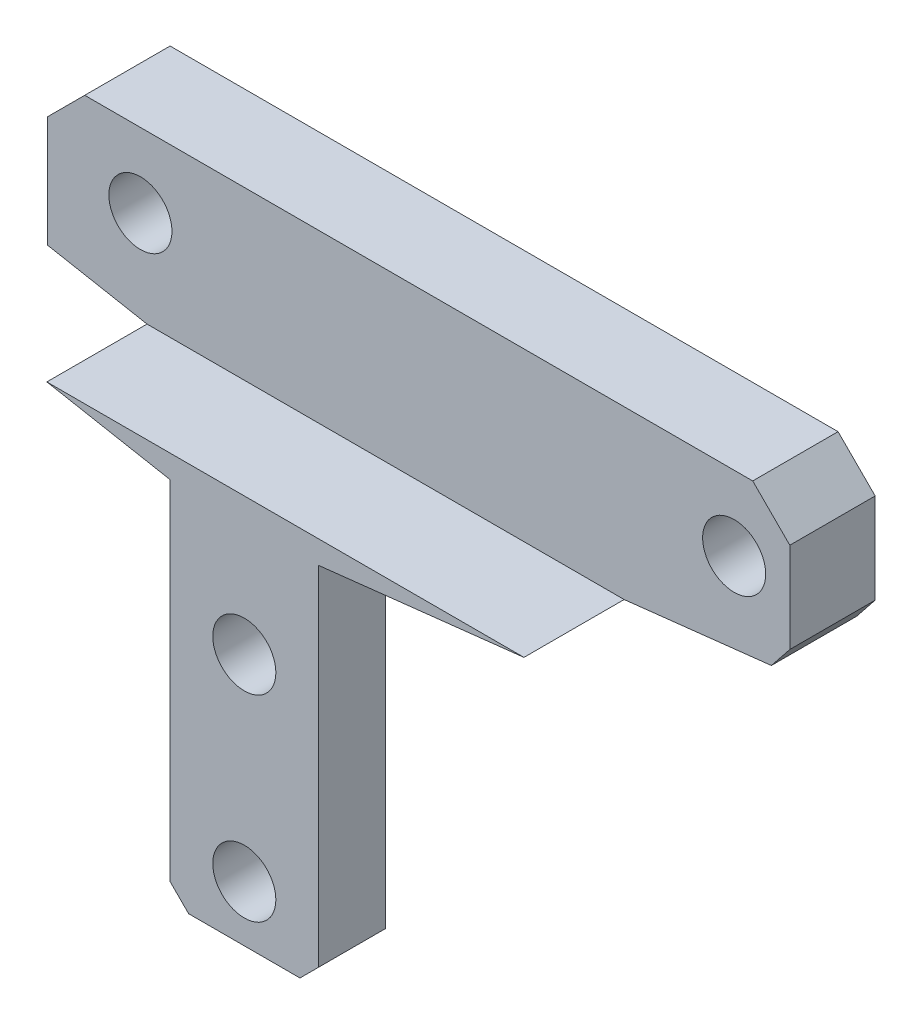
ISO-10303-21;
HEADER;
FILE_DESCRIPTION(('STEP AP214'),'2;1');
FILE_NAME('part.step','',(''),(''),'','','');
FILE_SCHEMA(('AUTOMOTIVE_DESIGN { 1 0 10303 214 1 1 1 1 }'));
ENDSEC;
DATA;
#1=APPLICATION_CONTEXT('core data for automotive mechanical design processes');
#2=APPLICATION_PROTOCOL_DEFINITION('international standard','automotive_design',2000,#1);
#3=PRODUCT_CONTEXT('',#1,'mechanical');
#4=PRODUCT('Part','Part','',(#3));
#5=PRODUCT_RELATED_PRODUCT_CATEGORY('part','',(#4));
#6=PRODUCT_DEFINITION_FORMATION('','',#4);
#7=PRODUCT_DEFINITION_CONTEXT('part definition',#1,'design');
#8=PRODUCT_DEFINITION('design','',#6,#7);
#9=PRODUCT_DEFINITION_SHAPE('','',#8);
#10=(LENGTH_UNIT() NAMED_UNIT(*) SI_UNIT(.MILLI.,.METRE.));
#11=(NAMED_UNIT(*) PLANE_ANGLE_UNIT() SI_UNIT($,.RADIAN.));
#12=(NAMED_UNIT(*) SI_UNIT($,.STERADIAN.) SOLID_ANGLE_UNIT());
#13=UNCERTAINTY_MEASURE_WITH_UNIT(LENGTH_MEASURE(1.E-05),#10,'distance_accuracy_value','');
#14=(GEOMETRIC_REPRESENTATION_CONTEXT(3) GLOBAL_UNCERTAINTY_ASSIGNED_CONTEXT((#13)) GLOBAL_UNIT_ASSIGNED_CONTEXT((#10,
#11,#12)) REPRESENTATION_CONTEXT('',''));
#15=CARTESIAN_POINT('',(0.,0.,0.));
#16=DIRECTION('',(0.,0.,1.));
#17=DIRECTION('',(1.,0.,0.));
#18=AXIS2_PLACEMENT_3D('',#15,#16,#17);
#19=CARTESIAN_POINT('',(10.,2.,5.5));
#20=DIRECTION('',(-1.,0.,0.));
#21=DIRECTION('',(0.,-1.,0.));
#22=AXIS2_PLACEMENT_3D('',#19,#20,#21);
#23=PLANE('',#22);
#24=DIRECTION('',(0.,0.,-1.));
#25=VECTOR('',#24,1.);
#26=CARTESIAN_POINT('',(10.,-1.43341641136647,5.5));
#27=LINE('',#26,#25);
#28=CARTESIAN_POINT('',(10.,-1.43341641136647,3.3));
#29=VERTEX_POINT('',#28);
#30=CARTESIAN_POINT('',(10.,-1.43341641136647,1.));
#31=VERTEX_POINT('',#30);
#32=EDGE_CURVE('E317',#29,#31,#27,.T.);
#33=ORIENTED_EDGE('',*,*,#32,.T.);
#34=DIRECTION('',(0.,-1.,0.));
#35=VECTOR('',#34,1.);
#36=CARTESIAN_POINT('',(10.,0.999999999999999,1.));
#37=LINE('',#36,#35);
#38=CARTESIAN_POINT('',(10.,0.999999999999999,1.));
#39=VERTEX_POINT('',#38);
#40=EDGE_CURVE('E57',#39,#31,#37,.T.);
#41=ORIENTED_EDGE('',*,*,#40,.F.);
#42=DIRECTION('',(0.,0.,1.));
#43=VECTOR('',#42,1.);
#44=CARTESIAN_POINT('',(10.,0.999999999999999,5.5));
#45=LINE('',#44,#43);
#46=CARTESIAN_POINT('',(10.,0.999999999999999,3.3));
#47=VERTEX_POINT('',#46);
#48=EDGE_CURVE('E299',#39,#47,#45,.T.);
#49=ORIENTED_EDGE('',*,*,#48,.T.);
#50=DIRECTION('',(0.,1.,0.));
#51=VECTOR('',#50,1.);
#52=CARTESIAN_POINT('',(10.,-2.5,3.3));
#53=LINE('',#52,#51);
#54=EDGE_CURVE('E251',#29,#47,#53,.T.);
#55=ORIENTED_EDGE('',*,*,#54,.F.);
#56=EDGE_LOOP('',(#33,#41,#49,#55));
#57=FACE_BOUND('',#56,.T.);
#58=ADVANCED_FACE('F41',(#57),#23,.F.);
#59=CARTESIAN_POINT('',(-10.,2.,5.5));
#60=DIRECTION('',(0.,-1.,0.));
#61=DIRECTION('',(0.,0.,-1.));
#62=AXIS2_PLACEMENT_3D('',#59,#60,#61);
#63=PLANE('',#62);
#64=DIRECTION('',(0.,0.,-1.));
#65=VECTOR('',#64,1.);
#66=CARTESIAN_POINT('',(9.00000000000001,2.,5.5));
#67=LINE('',#66,#65);
#68=CARTESIAN_POINT('',(9.00000000000001,2.,3.3));
#69=VERTEX_POINT('',#68);
#70=CARTESIAN_POINT('',(9.00000000000001,2.,1.));
#71=VERTEX_POINT('',#70);
#72=EDGE_CURVE('E294',#69,#71,#67,.T.);
#73=ORIENTED_EDGE('',*,*,#72,.T.);
#74=DIRECTION('',(1.,0.,0.));
#75=VECTOR('',#74,1.);
#76=CARTESIAN_POINT('',(-8.99999999999999,2.,1.));
#77=LINE('',#76,#75);
#78=CARTESIAN_POINT('',(-8.99999999999999,2.,1.));
#79=VERTEX_POINT('',#78);
#80=EDGE_CURVE('E231',#79,#71,#77,.T.);
#81=ORIENTED_EDGE('',*,*,#80,.F.);
#82=DIRECTION('',(0.,0.,1.));
#83=VECTOR('',#82,1.);
#84=CARTESIAN_POINT('',(-8.99999999999999,2.,5.5));
#85=LINE('',#84,#83);
#86=CARTESIAN_POINT('',(-8.99999999999999,2.,3.3));
#87=VERTEX_POINT('',#86);
#88=EDGE_CURVE('E297',#79,#87,#85,.T.);
#89=ORIENTED_EDGE('',*,*,#88,.T.);
#90=DIRECTION('',(-1.,0.,0.));
#91=VECTOR('',#90,1.);
#92=CARTESIAN_POINT('',(9.00000000000001,2.,3.3));
#93=LINE('',#92,#91);
#94=EDGE_CURVE('E241',#69,#87,#93,.T.);
#95=ORIENTED_EDGE('',*,*,#94,.F.);
#96=EDGE_LOOP('',(#73,#81,#89,#95));
#97=FACE_BOUND('',#96,.T.);
#98=ADVANCED_FACE('F349',(#97),#63,.F.);
#99=CARTESIAN_POINT('',(-10.,2.,5.5));
#100=DIRECTION('',(1.,0.,0.));
#101=DIRECTION('',(0.,1.,0.));
#102=AXIS2_PLACEMENT_3D('',#99,#100,#101);
#103=PLANE('',#102);
#104=DIRECTION('',(0.,0.,-1.));
#105=VECTOR('',#104,1.);
#106=CARTESIAN_POINT('',(-10.,0.999999999999998,5.5));
#107=LINE('',#106,#105);
#108=CARTESIAN_POINT('',(-10.,0.999999999999998,3.3));
#109=VERTEX_POINT('',#108);
#110=CARTESIAN_POINT('',(-10.,0.999999999999998,1.));
#111=VERTEX_POINT('',#110);
#112=EDGE_CURVE('E291',#109,#111,#107,.T.);
#113=ORIENTED_EDGE('',*,*,#112,.T.);
#114=DIRECTION('',(0.,1.,0.));
#115=VECTOR('',#114,1.);
#116=CARTESIAN_POINT('',(-9.99999999999999,-2.,1.));
#117=LINE('',#116,#115);
#118=CARTESIAN_POINT('',(-9.99999999999999,-2.,1.));
#119=VERTEX_POINT('',#118);
#120=EDGE_CURVE('E227',#119,#111,#117,.T.);
#121=ORIENTED_EDGE('',*,*,#120,.F.);
#122=DIRECTION('',(0.,0.,-1.));
#123=VECTOR('',#122,1.);
#124=CARTESIAN_POINT('',(-9.99999999999999,-2.,5.5));
#125=LINE('',#124,#123);
#126=CARTESIAN_POINT('',(-9.99999999999999,-2.,3.3));
#127=VERTEX_POINT('',#126);
#128=EDGE_CURVE('E278',#127,#119,#125,.T.);
#129=ORIENTED_EDGE('',*,*,#128,.F.);
#130=DIRECTION('',(0.,-1.,0.));
#131=VECTOR('',#130,1.);
#132=CARTESIAN_POINT('',(-10.,0.999999999999998,3.3));
#133=LINE('',#132,#131);
#134=EDGE_CURVE('E246',#109,#127,#133,.T.);
#135=ORIENTED_EDGE('',*,*,#134,.F.);
#136=EDGE_LOOP('',(#113,#121,#129,#135));
#137=FACE_BOUND('',#136,.T.);
#138=ADVANCED_FACE('F339',(#137),#103,.F.);
#139=CARTESIAN_POINT('',(-7.5,0.,5.5));
#140=DIRECTION('',(0.,0.,-1.));
#141=DIRECTION('',(-1.,0.,0.));
#142=AXIS2_PLACEMENT_3D('',#139,#140,#141);
#143=CYLINDRICAL_SURFACE('',#142,0.85);
#144=CARTESIAN_POINT('',(-7.5,0.,1.));
#145=DIRECTION('',(0.,0.,-1.));
#146=DIRECTION('',(-1.,0.,0.));
#147=AXIS2_PLACEMENT_3D('',#144,#145,#146);
#148=CIRCLE('',#147,0.85);
#149=CARTESIAN_POINT('',(-8.35,0.,1.));
#150=VERTEX_POINT('',#149);
#151=EDGE_CURVE('E213',#150,#150,#148,.T.);
#152=ORIENTED_EDGE('',*,*,#151,.T.);
#153=EDGE_LOOP('',(#152));
#154=FACE_BOUND('',#153,.T.);
#155=CARTESIAN_POINT('',(-7.5,0.,3.3));
#156=DIRECTION('',(0.,0.,1.));
#157=DIRECTION('',(1.,0.,0.));
#158=AXIS2_PLACEMENT_3D('',#155,#156,#157);
#159=CIRCLE('',#158,0.85);
#160=CARTESIAN_POINT('',(-6.65,0.,3.3));
#161=VERTEX_POINT('',#160);
#162=EDGE_CURVE('E233',#161,#161,#159,.T.);
#163=ORIENTED_EDGE('',*,*,#162,.T.);
#164=EDGE_LOOP('',(#163));
#165=FACE_BOUND('',#164,.T.);
#166=ADVANCED_FACE('F437',(#154,#165),#143,.F.);
#167=CARTESIAN_POINT('',(8.5,0.,5.5));
#168=DIRECTION('',(0.,0.,-1.));
#169=DIRECTION('',(-1.,0.,0.));
#170=AXIS2_PLACEMENT_3D('',#167,#168,#169);
#171=CYLINDRICAL_SURFACE('',#170,0.85);
#172=CARTESIAN_POINT('',(8.5,0.,1.));
#173=DIRECTION('',(0.,0.,-1.));
#174=DIRECTION('',(-1.,0.,0.));
#175=AXIS2_PLACEMENT_3D('',#172,#173,#174);
#176=CIRCLE('',#175,0.85);
#177=CARTESIAN_POINT('',(7.65,0.,1.));
#178=VERTEX_POINT('',#177);
#179=EDGE_CURVE('E210',#178,#178,#176,.T.);
#180=ORIENTED_EDGE('',*,*,#179,.T.);
#181=EDGE_LOOP('',(#180));
#182=FACE_BOUND('',#181,.T.);
#183=CARTESIAN_POINT('',(8.5,0.,3.3));
#184=DIRECTION('',(0.,0.,1.));
#185=DIRECTION('',(1.,0.,0.));
#186=AXIS2_PLACEMENT_3D('',#183,#184,#185);
#187=CIRCLE('',#186,0.85);
#188=CARTESIAN_POINT('',(9.35,0.,3.3));
#189=VERTEX_POINT('',#188);
#190=EDGE_CURVE('E236',#189,#189,#187,.T.);
#191=ORIENTED_EDGE('',*,*,#190,.T.);
#192=EDGE_LOOP('',(#191));
#193=FACE_BOUND('',#192,.T.);
#194=ADVANCED_FACE('F367',(#182,#193),#171,.F.);
#195=CARTESIAN_POINT('',(-10.,0.999999999999999,5.5));
#196=DIRECTION('',(0.707106781186546,-0.707106781186549,0.));
#197=DIRECTION('',(0.,0.,-1.));
#198=AXIS2_PLACEMENT_3D('',#195,#196,#197);
#199=PLANE('',#198);
#200=DIRECTION('',(0.707106781186548,0.707106781186547,0.));
#201=VECTOR('',#200,1.);
#202=CARTESIAN_POINT('',(-10.,0.999999999999998,1.));
#203=LINE('',#202,#201);
#204=EDGE_CURVE('E229',#111,#79,#203,.T.);
#205=ORIENTED_EDGE('',*,*,#204,.F.);
#206=ORIENTED_EDGE('',*,*,#112,.F.);
#207=DIRECTION('',(-0.707106781186548,-0.707106781186547,0.));
#208=VECTOR('',#207,1.);
#209=CARTESIAN_POINT('',(-8.99999999999999,2.,3.3));
#210=LINE('',#209,#208);
#211=EDGE_CURVE('E244',#87,#109,#210,.T.);
#212=ORIENTED_EDGE('',*,*,#211,.F.);
#213=ORIENTED_EDGE('',*,*,#88,.F.);
#214=EDGE_LOOP('',(#205,#206,#212,#213));
#215=FACE_BOUND('',#214,.T.);
#216=ADVANCED_FACE('F345',(#215),#199,.F.);
#217=CARTESIAN_POINT('',(9.00000000000001,2.,5.5));
#218=DIRECTION('',(-0.707106781186549,-0.707106781186546,0.));
#219=DIRECTION('',(0.,0.,-1.));
#220=AXIS2_PLACEMENT_3D('',#217,#218,#219);
#221=PLANE('',#220);
#222=DIRECTION('',(0.707106781186546,-0.707106781186549,0.));
#223=VECTOR('',#222,1.);
#224=CARTESIAN_POINT('',(9.00000000000001,2.,1.));
#225=LINE('',#224,#223);
#226=EDGE_CURVE('E216',#71,#39,#225,.T.);
#227=ORIENTED_EDGE('',*,*,#226,.F.);
#228=ORIENTED_EDGE('',*,*,#72,.F.);
#229=DIRECTION('',(-0.707106781186546,0.707106781186549,0.));
#230=VECTOR('',#229,1.);
#231=CARTESIAN_POINT('',(10.,0.999999999999999,3.3));
#232=LINE('',#231,#230);
#233=EDGE_CURVE('E239',#47,#69,#232,.T.);
#234=ORIENTED_EDGE('',*,*,#233,.F.);
#235=ORIENTED_EDGE('',*,*,#48,.F.);
#236=EDGE_LOOP('',(#227,#228,#234,#235));
#237=FACE_BOUND('',#236,.T.);
#238=ADVANCED_FACE('F356',(#237),#221,.F.);
#239=CARTESIAN_POINT('',(-4.,-3.12,5.5));
#240=DIRECTION('',(1.,0.,0.));
#241=DIRECTION('',(0.,1.,0.));
#242=AXIS2_PLACEMENT_3D('',#239,#240,#241);
#243=PLANE('',#242);
#244=DIRECTION('',(0.,1.,0.));
#245=VECTOR('',#244,1.);
#246=CARTESIAN_POINT('',(-4.,-13.,4.2));
#247=LINE('',#246,#245);
#248=CARTESIAN_POINT('',(-4.,-12.5,4.2));
#249=VERTEX_POINT('',#248);
#250=CARTESIAN_POINT('',(-4.,-4.12000000000001,4.2));
#251=VERTEX_POINT('',#250);
#252=EDGE_CURVE('E268',#249,#251,#247,.T.);
#253=ORIENTED_EDGE('',*,*,#252,.F.);
#254=DIRECTION('',(0.,0.,1.));
#255=VECTOR('',#254,1.);
#256=CARTESIAN_POINT('',(-4.,-12.5,5.5));
#257=LINE('',#256,#255);
#258=CARTESIAN_POINT('',(-4.,-12.5,6.));
#259=VERTEX_POINT('',#258);
#260=EDGE_CURVE('E310',#249,#259,#257,.T.);
#261=ORIENTED_EDGE('',*,*,#260,.T.);
#262=DIRECTION('',(0.,-1.,0.));
#263=VECTOR('',#262,1.);
#264=CARTESIAN_POINT('',(-4.,-3.12,6.));
#265=LINE('',#264,#263);
#266=CARTESIAN_POINT('',(-4.,-3.12,6.));
#267=VERTEX_POINT('',#266);
#268=EDGE_CURVE('E201',#267,#259,#265,.T.);
#269=ORIENTED_EDGE('',*,*,#268,.F.);
#270=DIRECTION('',(0.,0.,-1.));
#271=VECTOR('',#270,1.);
#272=CARTESIAN_POINT('',(-4.,-3.12,5.5));
#273=LINE('',#272,#271);
#274=CARTESIAN_POINT('',(-4.,-3.12,3.2));
#275=VERTEX_POINT('',#274);
#276=EDGE_CURVE('E172',#267,#275,#273,.T.);
#277=ORIENTED_EDGE('',*,*,#276,.T.);
#278=DIRECTION('',(0.,-0.707106781186551,0.707106781186544));
#279=VECTOR('',#278,1.);
#280=CARTESIAN_POINT('',(-4.,-4.27,4.34999999999999));
#281=LINE('',#280,#279);
#282=EDGE_CURVE('E288',#275,#251,#281,.T.);
#283=ORIENTED_EDGE('',*,*,#282,.T.);
#284=EDGE_LOOP('',(#253,#261,#269,#277,#283));
#285=FACE_BOUND('',#284,.T.);
#286=ADVANCED_FACE('F358',(#285),#243,.F.);
#287=CARTESIAN_POINT('',(-4.,-13.,5.5));
#288=DIRECTION('',(0.,1.,0.));
#289=DIRECTION('',(0.,0.,1.));
#290=AXIS2_PLACEMENT_3D('',#287,#288,#289);
#291=PLANE('',#290);
#292=DIRECTION('',(0.,0.,1.));
#293=VECTOR('',#292,1.);
#294=CARTESIAN_POINT('',(-0.500000000000001,-13.,5.5));
#295=LINE('',#294,#293);
#296=CARTESIAN_POINT('',(-0.500000000000001,-13.,4.2));
#297=VERTEX_POINT('',#296);
#298=CARTESIAN_POINT('',(-0.500000000000001,-13.,6.));
#299=VERTEX_POINT('',#298);
#300=EDGE_CURVE('E301',#297,#299,#295,.T.);
#301=ORIENTED_EDGE('',*,*,#300,.T.);
#302=DIRECTION('',(1.,0.,0.));
#303=VECTOR('',#302,1.);
#304=CARTESIAN_POINT('',(-3.5,-13.,6.));
#305=LINE('',#304,#303);
#306=CARTESIAN_POINT('',(-3.5,-13.,6.));
#307=VERTEX_POINT('',#306);
#308=EDGE_CURVE('E207',#307,#299,#305,.T.);
#309=ORIENTED_EDGE('',*,*,#308,.F.);
#310=DIRECTION('',(0.,0.,-1.));
#311=VECTOR('',#310,1.);
#312=CARTESIAN_POINT('',(-3.5,-13.,5.5));
#313=LINE('',#312,#311);
#314=CARTESIAN_POINT('',(-3.5,-13.,4.2));
#315=VERTEX_POINT('',#314);
#316=EDGE_CURVE('E303',#307,#315,#313,.T.);
#317=ORIENTED_EDGE('',*,*,#316,.T.);
#318=DIRECTION('',(-1.,0.,0.));
#319=VECTOR('',#318,1.);
#320=CARTESIAN_POINT('',(0.,-13.,4.2));
#321=LINE('',#320,#319);
#322=EDGE_CURVE('E265',#297,#315,#321,.T.);
#323=ORIENTED_EDGE('',*,*,#322,.F.);
#324=EDGE_LOOP('',(#301,#309,#317,#323));
#325=FACE_BOUND('',#324,.T.);
#326=ADVANCED_FACE('F364',(#325),#291,.F.);
#327=CARTESIAN_POINT('',(0.,-3.12,5.5));
#328=DIRECTION('',(-1.,0.,0.));
#329=DIRECTION('',(0.,-1.,0.));
#330=AXIS2_PLACEMENT_3D('',#327,#328,#329);
#331=PLANE('',#330);
#332=DIRECTION('',(0.,0.,-1.));
#333=VECTOR('',#332,1.);
#334=CARTESIAN_POINT('',(0.,-3.12,5.5));
#335=LINE('',#334,#333);
#336=CARTESIAN_POINT('',(0.,-3.12,6.));
#337=VERTEX_POINT('',#336);
#338=CARTESIAN_POINT('',(0.,-3.12,3.2));
#339=VERTEX_POINT('',#338);
#340=EDGE_CURVE('E161',#337,#339,#335,.T.);
#341=ORIENTED_EDGE('',*,*,#340,.F.);
#342=DIRECTION('',(0.,1.,0.));
#343=VECTOR('',#342,1.);
#344=CARTESIAN_POINT('',(0.,-12.5,6.));
#345=LINE('',#344,#343);
#346=CARTESIAN_POINT('',(0.,-12.5,6.));
#347=VERTEX_POINT('',#346);
#348=EDGE_CURVE('E166',#347,#337,#345,.T.);
#349=ORIENTED_EDGE('',*,*,#348,.F.);
#350=DIRECTION('',(0.,0.,-1.));
#351=VECTOR('',#350,1.);
#352=CARTESIAN_POINT('',(0.,-12.5,5.5));
#353=LINE('',#352,#351);
#354=CARTESIAN_POINT('',(0.,-12.5,4.2));
#355=VERTEX_POINT('',#354);
#356=EDGE_CURVE('E312',#347,#355,#353,.T.);
#357=ORIENTED_EDGE('',*,*,#356,.T.);
#358=DIRECTION('',(0.,-1.,0.));
#359=VECTOR('',#358,1.);
#360=CARTESIAN_POINT('',(0.,-3.12,4.2));
#361=LINE('',#360,#359);
#362=CARTESIAN_POINT('',(0.,-4.12000000000001,4.2));
#363=VERTEX_POINT('',#362);
#364=EDGE_CURVE('E270',#363,#355,#361,.T.);
#365=ORIENTED_EDGE('',*,*,#364,.F.);
#366=DIRECTION('',(0.,0.707106781186551,-0.707106781186544));
#367=VECTOR('',#366,1.);
#368=CARTESIAN_POINT('',(0.,-4.27,4.34999999999999));
#369=LINE('',#368,#367);
#370=EDGE_CURVE('E168',#363,#339,#369,.T.);
#371=ORIENTED_EDGE('',*,*,#370,.T.);
#372=EDGE_LOOP('',(#341,#349,#357,#365,#371));
#373=FACE_BOUND('',#372,.T.);
#374=ADVANCED_FACE('F163',(#373),#331,.F.);
#375=CARTESIAN_POINT('',(-2.,-11.5,5.5));
#376=DIRECTION('',(0.,0.,-1.));
#377=DIRECTION('',(-1.,0.,0.));
#378=AXIS2_PLACEMENT_3D('',#375,#376,#377);
#379=CYLINDRICAL_SURFACE('',#378,0.85);
#380=CARTESIAN_POINT('',(-2.,-11.5,4.2));
#381=DIRECTION('',(0.,0.,-1.));
#382=DIRECTION('',(-1.,0.,0.));
#383=AXIS2_PLACEMENT_3D('',#380,#381,#382);
#384=CIRCLE('',#383,0.85);
#385=CARTESIAN_POINT('',(-2.85,-11.5,4.2));
#386=VERTEX_POINT('',#385);
#387=EDGE_CURVE('E262',#386,#386,#384,.T.);
#388=ORIENTED_EDGE('',*,*,#387,.T.);
#389=EDGE_LOOP('',(#388));
#390=FACE_BOUND('',#389,.T.);
#391=CARTESIAN_POINT('',(-2.,-11.5,6.));
#392=DIRECTION('',(0.,0.,1.));
#393=DIRECTION('',(1.,0.,0.));
#394=AXIS2_PLACEMENT_3D('',#391,#392,#393);
#395=CIRCLE('',#394,0.85);
#396=CARTESIAN_POINT('',(-1.15,-11.5,6.));
#397=VERTEX_POINT('',#396);
#398=EDGE_CURVE('E190',#397,#397,#395,.T.);
#399=ORIENTED_EDGE('',*,*,#398,.T.);
#400=EDGE_LOOP('',(#399));
#401=FACE_BOUND('',#400,.T.);
#402=ADVANCED_FACE('F431',(#390,#401),#379,.F.);
#403=CARTESIAN_POINT('',(-2.,-6.2,5.5));
#404=DIRECTION('',(0.,0.,-1.));
#405=DIRECTION('',(-1.,0.,0.));
#406=AXIS2_PLACEMENT_3D('',#403,#404,#405);
#407=CYLINDRICAL_SURFACE('',#406,0.85);
#408=CARTESIAN_POINT('',(-2.,-6.2,4.2));
#409=DIRECTION('',(0.,0.,-1.));
#410=DIRECTION('',(-1.,0.,0.));
#411=AXIS2_PLACEMENT_3D('',#408,#409,#410);
#412=CIRCLE('',#411,0.85);
#413=CARTESIAN_POINT('',(-2.85,-6.2,4.2));
#414=VERTEX_POINT('',#413);
#415=EDGE_CURVE('E259',#414,#414,#412,.T.);
#416=ORIENTED_EDGE('',*,*,#415,.T.);
#417=EDGE_LOOP('',(#416));
#418=FACE_BOUND('',#417,.T.);
#419=CARTESIAN_POINT('',(-2.,-6.2,6.));
#420=DIRECTION('',(0.,0.,1.));
#421=DIRECTION('',(1.,0.,0.));
#422=AXIS2_PLACEMENT_3D('',#419,#420,#421);
#423=CIRCLE('',#422,0.85);
#424=CARTESIAN_POINT('',(-1.15,-6.2,6.));
#425=VERTEX_POINT('',#424);
#426=EDGE_CURVE('E193',#425,#425,#423,.T.);
#427=ORIENTED_EDGE('',*,*,#426,.T.);
#428=EDGE_LOOP('',(#427));
#429=FACE_BOUND('',#428,.T.);
#430=ADVANCED_FACE('F381',(#418,#429),#407,.F.);
#431=CARTESIAN_POINT('',(0.,-3.12,5.5));
#432=DIRECTION('',(-0.111304076447319,0.993786396851059,0.));
#433=DIRECTION('',(-0.993786396851058,-0.111304076447319,0.));
#434=AXIS2_PLACEMENT_3D('',#431,#432,#433);
#435=PLANE('',#434);
#436=DIRECTION('',(0.,0.,-1.));
#437=VECTOR('',#436,1.);
#438=CARTESIAN_POINT('',(0.,-3.12,4.2));
#439=LINE('',#438,#437);
#440=CARTESIAN_POINT('',(0.,-3.12,1.));
#441=VERTEX_POINT('',#440);
#442=EDGE_CURVE('E173',#339,#441,#439,.T.);
#443=ORIENTED_EDGE('',*,*,#442,.T.);
#444=DIRECTION('',(-0.993786396851058,-0.111304076447319,0.));
#445=VECTOR('',#444,1.);
#446=CARTESIAN_POINT('',(9.50310680157448,-2.05565203822366,1.));
#447=LINE('',#446,#445);
#448=CARTESIAN_POINT('',(9.50310680157448,-2.05565203822366,1.));
#449=VERTEX_POINT('',#448);
#450=EDGE_CURVE('E221',#449,#441,#447,.T.);
#451=ORIENTED_EDGE('',*,*,#450,.F.);
#452=DIRECTION('',(0.,0.,1.));
#453=VECTOR('',#452,1.);
#454=CARTESIAN_POINT('',(9.50310680157448,-2.05565203822366,5.5));
#455=LINE('',#454,#453);
#456=CARTESIAN_POINT('',(9.50310680157448,-2.05565203822366,3.3));
#457=VERTEX_POINT('',#456);
#458=EDGE_CURVE('E50',#449,#457,#455,.T.);
#459=ORIENTED_EDGE('',*,*,#458,.T.);
#460=DIRECTION('',(0.993786396851058,0.111304076447319,0.));
#461=VECTOR('',#460,1.);
#462=CARTESIAN_POINT('',(0.,-3.12,3.3));
#463=LINE('',#462,#461);
#464=CARTESIAN_POINT('',(5.53571428571447,-2.49999999999999,3.3));
#465=VERTEX_POINT('',#464);
#466=EDGE_CURVE('E256',#465,#457,#463,.T.);
#467=ORIENTED_EDGE('',*,*,#466,.F.);
#468=DIRECTION('',(0.,0.,1.));
#469=VECTOR('',#468,1.);
#470=CARTESIAN_POINT('',(5.53571428571428,-2.5,5.5));
#471=LINE('',#470,#469);
#472=CARTESIAN_POINT('',(5.53571428571447,-2.49999999999999,6.));
#473=VERTEX_POINT('',#472);
#474=EDGE_CURVE('E178',#465,#473,#471,.T.);
#475=ORIENTED_EDGE('',*,*,#474,.T.);
#476=DIRECTION('',(0.993786396851059,0.111304076447317,0.));
#477=VECTOR('',#476,1.);
#478=CARTESIAN_POINT('',(0.,-3.12,6.));
#479=LINE('',#478,#477);
#480=EDGE_CURVE('E176',#337,#473,#479,.T.);
#481=ORIENTED_EDGE('',*,*,#480,.F.);
#482=ORIENTED_EDGE('',*,*,#340,.T.);
#483=EDGE_LOOP('',(#443,#451,#459,#467,#475,#481,#482));
#484=FACE_BOUND('',#483,.T.);
#485=ADVANCED_FACE('F177',(#484),#435,.F.);
#486=CARTESIAN_POINT('',(-9.99999999999999,-2.,5.5));
#487=DIRECTION('',(0.183497113102886,0.98302024876546,0.));
#488=DIRECTION('',(-0.98302024876546,0.183497113102886,0.));
#489=AXIS2_PLACEMENT_3D('',#486,#487,#488);
#490=PLANE('',#489);
#491=ORIENTED_EDGE('',*,*,#128,.T.);
#492=DIRECTION('',(-0.98302024876546,0.183497113102886,0.));
#493=VECTOR('',#492,1.);
#494=CARTESIAN_POINT('',(-4.,-3.12,1.));
#495=LINE('',#494,#493);
#496=CARTESIAN_POINT('',(-4.,-3.12,1.));
#497=VERTEX_POINT('',#496);
#498=EDGE_CURVE('E225',#497,#119,#495,.T.);
#499=ORIENTED_EDGE('',*,*,#498,.F.);
#500=DIRECTION('',(0.,0.,-1.));
#501=VECTOR('',#500,1.);
#502=CARTESIAN_POINT('',(-4.,-3.12,4.2));
#503=LINE('',#502,#501);
#504=EDGE_CURVE('E273',#275,#497,#503,.T.);
#505=ORIENTED_EDGE('',*,*,#504,.F.);
#506=ORIENTED_EDGE('',*,*,#276,.F.);
#507=DIRECTION('',(0.98302024876546,-0.183497113102886,0.));
#508=VECTOR('',#507,1.);
#509=CARTESIAN_POINT('',(-7.32142857142856,-2.5,6.));
#510=LINE('',#509,#508);
#511=CARTESIAN_POINT('',(-7.32142857142856,-2.5,6.));
#512=VERTEX_POINT('',#511);
#513=EDGE_CURVE('E198',#512,#267,#510,.T.);
#514=ORIENTED_EDGE('',*,*,#513,.F.);
#515=DIRECTION('',(0.,0.,-1.));
#516=VECTOR('',#515,1.);
#517=CARTESIAN_POINT('',(-7.32142857142856,-2.5,5.5));
#518=LINE('',#517,#516);
#519=CARTESIAN_POINT('',(-7.32142857142856,-2.5,3.3));
#520=VERTEX_POINT('',#519);
#521=EDGE_CURVE('E314',#512,#520,#518,.T.);
#522=ORIENTED_EDGE('',*,*,#521,.T.);
#523=DIRECTION('',(0.98302024876546,-0.183497113102886,0.));
#524=VECTOR('',#523,1.);
#525=CARTESIAN_POINT('',(-9.99999999999999,-2.,3.3));
#526=LINE('',#525,#524);
#527=EDGE_CURVE('E254',#127,#520,#526,.T.);
#528=ORIENTED_EDGE('',*,*,#527,.F.);
#529=EDGE_LOOP('',(#491,#499,#505,#506,#514,#522,#528));
#530=FACE_BOUND('',#529,.T.);
#531=ADVANCED_FACE('F333',(#530),#490,.F.);
#532=CARTESIAN_POINT('',(0.,-3.12,4.2));
#533=DIRECTION('',(0.,1.,0.));
#534=DIRECTION('',(0.,0.,1.));
#535=AXIS2_PLACEMENT_3D('',#532,#533,#534);
#536=PLANE('',#535);
#537=ORIENTED_EDGE('',*,*,#504,.T.);
#538=DIRECTION('',(-1.,0.,0.));
#539=VECTOR('',#538,1.);
#540=CARTESIAN_POINT('',(0.,-3.12,1.));
#541=LINE('',#540,#539);
#542=EDGE_CURVE('E223',#441,#497,#541,.T.);
#543=ORIENTED_EDGE('',*,*,#542,.F.);
#544=ORIENTED_EDGE('',*,*,#442,.F.);
#545=DIRECTION('',(-1.,0.,0.));
#546=VECTOR('',#545,1.);
#547=CARTESIAN_POINT('',(0.,-3.12,3.2));
#548=LINE('',#547,#546);
#549=EDGE_CURVE('E284',#339,#275,#548,.T.);
#550=ORIENTED_EDGE('',*,*,#549,.T.);
#551=EDGE_LOOP('',(#537,#543,#544,#550));
#552=FACE_BOUND('',#551,.T.);
#553=ADVANCED_FACE('F328',(#552),#536,.F.);
#554=CARTESIAN_POINT('',(0.,0.,4.2));
#555=DIRECTION('',(0.,0.,-1.));
#556=DIRECTION('',(-1.,0.,0.));
#557=AXIS2_PLACEMENT_3D('',#554,#555,#556);
#558=PLANE('',#557);
#559=ORIENTED_EDGE('',*,*,#415,.F.);
#560=EDGE_LOOP('',(#559));
#561=FACE_BOUND('',#560,.T.);
#562=ORIENTED_EDGE('',*,*,#387,.F.);
#563=EDGE_LOOP('',(#562));
#564=FACE_BOUND('',#563,.T.);
#565=ORIENTED_EDGE('',*,*,#322,.T.);
#566=DIRECTION('',(0.707106781186545,-0.70710678118655,0.));
#567=VECTOR('',#566,1.);
#568=CARTESIAN_POINT('',(-8.25000000000001,-8.24999999999996,4.2));
#569=LINE('',#568,#567);
#570=EDGE_CURVE('E308',#315,#249,#569,.F.);
#571=ORIENTED_EDGE('',*,*,#570,.T.);
#572=ORIENTED_EDGE('',*,*,#252,.T.);
#573=DIRECTION('',(1.,0.,0.));
#574=VECTOR('',#573,1.);
#575=CARTESIAN_POINT('',(0.,-4.12000000000001,4.2));
#576=LINE('',#575,#574);
#577=EDGE_CURVE('E281',#251,#363,#576,.T.);
#578=ORIENTED_EDGE('',*,*,#577,.T.);
#579=ORIENTED_EDGE('',*,*,#364,.T.);
#580=DIRECTION('',(0.70710678118655,0.707106781186545,0.));
#581=VECTOR('',#580,1.);
#582=CARTESIAN_POINT('',(6.25,-6.25000000000005,4.2));
#583=LINE('',#582,#581);
#584=EDGE_CURVE('E306',#355,#297,#583,.F.);
#585=ORIENTED_EDGE('',*,*,#584,.T.);
#586=EDGE_LOOP('',(#565,#571,#572,#578,#579,#585));
#587=FACE_BOUND('',#586,.T.);
#588=ADVANCED_FACE('F389',(#561,#564,#587),#558,.T.);
#589=CARTESIAN_POINT('',(0.,-4.12000000000001,4.2));
#590=DIRECTION('',(0.,0.707106781186544,0.707106781186551));
#591=DIRECTION('',(1.,0.,0.));
#592=AXIS2_PLACEMENT_3D('',#589,#590,#591);
#593=PLANE('',#592);
#594=ORIENTED_EDGE('',*,*,#282,.F.);
#595=ORIENTED_EDGE('',*,*,#549,.F.);
#596=ORIENTED_EDGE('',*,*,#370,.F.);
#597=ORIENTED_EDGE('',*,*,#577,.F.);
#598=EDGE_LOOP('',(#594,#595,#596,#597));
#599=FACE_BOUND('',#598,.T.);
#600=ADVANCED_FACE('F383',(#599),#593,.F.);
#601=CARTESIAN_POINT('',(-3.5,-13.,5.5));
#602=DIRECTION('',(0.70710678118655,0.707106781186545,0.));
#603=DIRECTION('',(0.,0.,-1.));
#604=AXIS2_PLACEMENT_3D('',#601,#602,#603);
#605=PLANE('',#604);
#606=ORIENTED_EDGE('',*,*,#316,.F.);
#607=DIRECTION('',(0.707106781186545,-0.70710678118655,0.));
#608=VECTOR('',#607,1.);
#609=CARTESIAN_POINT('',(-4.,-12.5,6.));
#610=LINE('',#609,#608);
#611=EDGE_CURVE('E204',#259,#307,#610,.T.);
#612=ORIENTED_EDGE('',*,*,#611,.F.);
#613=ORIENTED_EDGE('',*,*,#260,.F.);
#614=ORIENTED_EDGE('',*,*,#570,.F.);
#615=EDGE_LOOP('',(#606,#612,#613,#614));
#616=FACE_BOUND('',#615,.T.);
#617=ADVANCED_FACE('F388',(#616),#605,.F.);
#618=CARTESIAN_POINT('',(0.,-12.5,5.5));
#619=DIRECTION('',(-0.707106781186545,0.70710678118655,0.));
#620=DIRECTION('',(0.,0.,-1.));
#621=AXIS2_PLACEMENT_3D('',#618,#619,#620);
#622=PLANE('',#621);
#623=ORIENTED_EDGE('',*,*,#356,.F.);
#624=DIRECTION('',(0.70710678118655,0.707106781186545,0.));
#625=VECTOR('',#624,1.);
#626=CARTESIAN_POINT('',(-0.500000000000001,-13.,6.));
#627=LINE('',#626,#625);
#628=EDGE_CURVE('E189',#299,#347,#627,.T.);
#629=ORIENTED_EDGE('',*,*,#628,.F.);
#630=ORIENTED_EDGE('',*,*,#300,.F.);
#631=ORIENTED_EDGE('',*,*,#584,.F.);
#632=EDGE_LOOP('',(#623,#629,#630,#631));
#633=FACE_BOUND('',#632,.T.);
#634=ADVANCED_FACE('F401',(#633),#622,.F.);
#635=CARTESIAN_POINT('',(-9.99999999999999,-2.5,3.3));
#636=DIRECTION('',(0.,-1.,0.));
#637=DIRECTION('',(0.,0.,-1.));
#638=AXIS2_PLACEMENT_3D('',#635,#636,#637);
#639=PLANE('',#638);
#640=DIRECTION('',(1.,0.,0.));
#641=VECTOR('',#640,1.);
#642=CARTESIAN_POINT('',(-9.99999999999999,-2.5,3.3));
#643=LINE('',#642,#641);
#644=EDGE_CURVE('E248',#520,#465,#643,.T.);
#645=ORIENTED_EDGE('',*,*,#644,.F.);
#646=ORIENTED_EDGE('',*,*,#521,.F.);
#647=DIRECTION('',(-1.,0.,0.));
#648=VECTOR('',#647,1.);
#649=CARTESIAN_POINT('',(5.53571428571447,-2.49999999999999,6.));
#650=LINE('',#649,#648);
#651=EDGE_CURVE('E182',#473,#512,#650,.T.);
#652=ORIENTED_EDGE('',*,*,#651,.F.);
#653=ORIENTED_EDGE('',*,*,#474,.F.);
#654=EDGE_LOOP('',(#645,#646,#652,#653));
#655=FACE_BOUND('',#654,.T.);
#656=ADVANCED_FACE('F405',(#655),#639,.F.);
#657=CARTESIAN_POINT('',(0.,0.,3.3));
#658=DIRECTION('',(0.,0.,1.));
#659=DIRECTION('',(1.,0.,0.));
#660=AXIS2_PLACEMENT_3D('',#657,#658,#659);
#661=PLANE('',#660);
#662=ORIENTED_EDGE('',*,*,#162,.F.);
#663=EDGE_LOOP('',(#662));
#664=FACE_BOUND('',#663,.T.);
#665=ORIENTED_EDGE('',*,*,#190,.F.);
#666=EDGE_LOOP('',(#665));
#667=FACE_BOUND('',#666,.T.);
#668=ORIENTED_EDGE('',*,*,#466,.T.);
#669=DIRECTION('',(-0.624009233034728,-0.781416967493931,0.));
#670=VECTOR('',#669,1.);
#671=CARTESIAN_POINT('',(6.80507495768194,-5.43426849138635,3.3));
#672=LINE('',#671,#670);
#673=EDGE_CURVE('E11',#457,#29,#672,.F.);
#674=ORIENTED_EDGE('',*,*,#673,.T.);
#675=ORIENTED_EDGE('',*,*,#54,.T.);
#676=ORIENTED_EDGE('',*,*,#233,.T.);
#677=ORIENTED_EDGE('',*,*,#94,.T.);
#678=ORIENTED_EDGE('',*,*,#211,.T.);
#679=ORIENTED_EDGE('',*,*,#134,.T.);
#680=ORIENTED_EDGE('',*,*,#527,.T.);
#681=ORIENTED_EDGE('',*,*,#644,.T.);
#682=EDGE_LOOP('',(#668,#674,#675,#676,#677,#678,#679,#680,#681));
#683=FACE_BOUND('',#682,.T.);
#684=ADVANCED_FACE('F352',(#664,#667,#683),#661,.T.);
#685=CARTESIAN_POINT('',(10.,-1.43341641136647,5.5));
#686=DIRECTION('',(-0.781416967493931,0.624009233034728,0.));
#687=DIRECTION('',(0.,0.,-1.));
#688=AXIS2_PLACEMENT_3D('',#685,#686,#687);
#689=PLANE('',#688);
#690=DIRECTION('',(-0.624009233034728,-0.781416967493931,0.));
#691=VECTOR('',#690,1.);
#692=CARTESIAN_POINT('',(10.,-1.43341641136647,1.));
#693=LINE('',#692,#691);
#694=EDGE_CURVE('E219',#31,#449,#693,.T.);
#695=ORIENTED_EDGE('',*,*,#694,.F.);
#696=ORIENTED_EDGE('',*,*,#32,.F.);
#697=ORIENTED_EDGE('',*,*,#673,.F.);
#698=ORIENTED_EDGE('',*,*,#458,.F.);
#699=EDGE_LOOP('',(#695,#696,#697,#698));
#700=FACE_BOUND('',#699,.T.);
#701=ADVANCED_FACE('F44',(#700),#689,.F.);
#702=CARTESIAN_POINT('',(0.,0.,1.));
#703=DIRECTION('',(0.,0.,1.));
#704=DIRECTION('',(1.,0.,0.));
#705=AXIS2_PLACEMENT_3D('',#702,#703,#704);
#706=PLANE('',#705);
#707=ORIENTED_EDGE('',*,*,#179,.F.);
#708=EDGE_LOOP('',(#707));
#709=FACE_BOUND('',#708,.T.);
#710=ORIENTED_EDGE('',*,*,#151,.F.);
#711=EDGE_LOOP('',(#710));
#712=FACE_BOUND('',#711,.T.);
#713=ORIENTED_EDGE('',*,*,#226,.T.);
#714=ORIENTED_EDGE('',*,*,#40,.T.);
#715=ORIENTED_EDGE('',*,*,#694,.T.);
#716=ORIENTED_EDGE('',*,*,#450,.T.);
#717=ORIENTED_EDGE('',*,*,#542,.T.);
#718=ORIENTED_EDGE('',*,*,#498,.T.);
#719=ORIENTED_EDGE('',*,*,#120,.T.);
#720=ORIENTED_EDGE('',*,*,#204,.T.);
#721=ORIENTED_EDGE('',*,*,#80,.T.);
#722=EDGE_LOOP('',(#713,#714,#715,#716,#717,#718,#719,#720,#721));
#723=FACE_BOUND('',#722,.T.);
#724=ADVANCED_FACE('F325',(#709,#712,#723),#706,.F.);
#725=CARTESIAN_POINT('',(0.,0.,6.));
#726=DIRECTION('',(0.,0.,1.));
#727=DIRECTION('',(1.,0.,0.));
#728=AXIS2_PLACEMENT_3D('',#725,#726,#727);
#729=PLANE('',#728);
#730=ORIENTED_EDGE('',*,*,#398,.F.);
#731=EDGE_LOOP('',(#730));
#732=FACE_BOUND('',#731,.T.);
#733=ORIENTED_EDGE('',*,*,#348,.T.);
#734=ORIENTED_EDGE('',*,*,#480,.T.);
#735=ORIENTED_EDGE('',*,*,#651,.T.);
#736=ORIENTED_EDGE('',*,*,#513,.T.);
#737=ORIENTED_EDGE('',*,*,#268,.T.);
#738=ORIENTED_EDGE('',*,*,#611,.T.);
#739=ORIENTED_EDGE('',*,*,#308,.T.);
#740=ORIENTED_EDGE('',*,*,#628,.T.);
#741=EDGE_LOOP('',(#733,#734,#735,#736,#737,#738,#739,#740));
#742=FACE_BOUND('',#741,.T.);
#743=ORIENTED_EDGE('',*,*,#426,.F.);
#744=EDGE_LOOP('',(#743));
#745=FACE_BOUND('',#744,.T.);
#746=ADVANCED_FACE('F185',(#732,#742,#745),#729,.T.);
#747=CLOSED_SHELL('',(#58,#98,#138,#166,#194,#216,#238,#286,#326,#374,#402,#430,#485,#531,#553,
#588,#600,#617,#634,#656,#684,#701,#724,#746));
#748=MANIFOLD_SOLID_BREP('B2',#747);
#749=ADVANCED_BREP_SHAPE_REPRESENTATION('',(#18,#748),#14);
#750=SHAPE_DEFINITION_REPRESENTATION(#9,#749);
ENDSEC;
END-ISO-10303-21;
